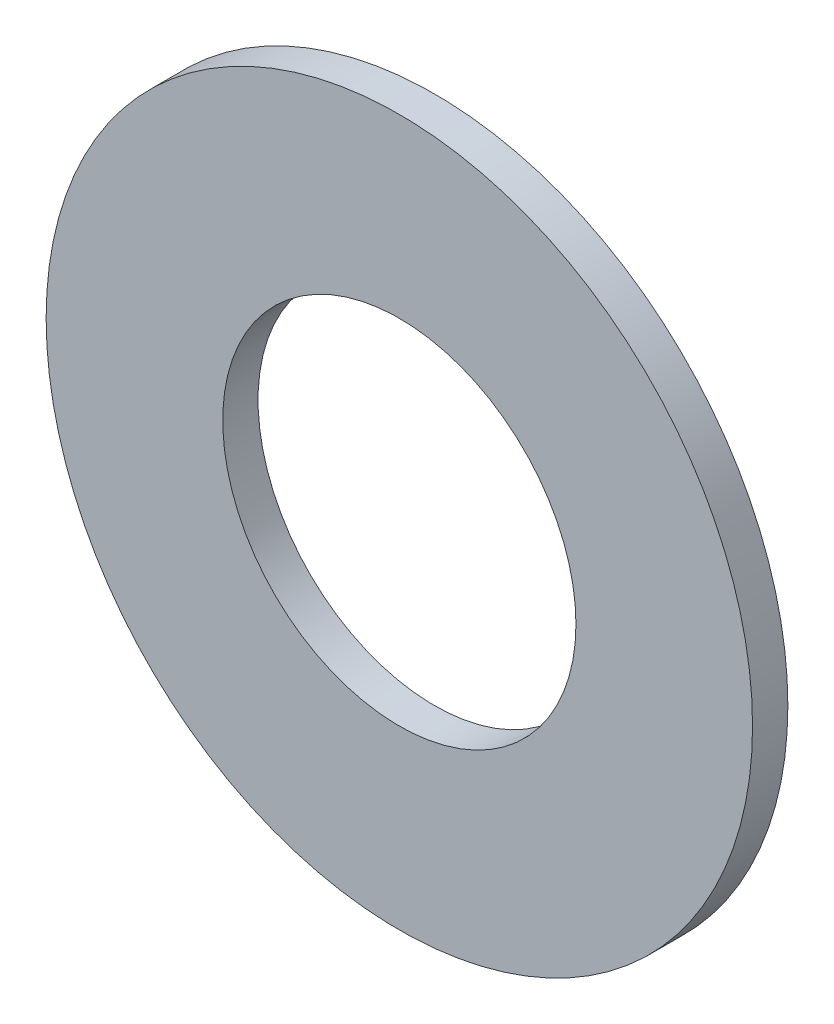
ISO-10303-21;
HEADER;
FILE_DESCRIPTION(('STEP AP214'),'2;1');
FILE_NAME('part.step','',(''),(''),'','','');
FILE_SCHEMA(('AUTOMOTIVE_DESIGN { 1 0 10303 214 1 1 1 1 }'));
ENDSEC;
DATA;
#1=APPLICATION_CONTEXT('core data for automotive mechanical design processes');
#2=APPLICATION_PROTOCOL_DEFINITION('international standard','automotive_design',2000,#1);
#3=PRODUCT_CONTEXT('',#1,'mechanical');
#4=PRODUCT('Part','Part','',(#3));
#5=PRODUCT_RELATED_PRODUCT_CATEGORY('part','',(#4));
#6=PRODUCT_DEFINITION_FORMATION('','',#4);
#7=PRODUCT_DEFINITION_CONTEXT('part definition',#1,'design');
#8=PRODUCT_DEFINITION('design','',#6,#7);
#9=PRODUCT_DEFINITION_SHAPE('','',#8);
#10=(LENGTH_UNIT() NAMED_UNIT(*) SI_UNIT(.MILLI.,.METRE.));
#11=(NAMED_UNIT(*) PLANE_ANGLE_UNIT() SI_UNIT($,.RADIAN.));
#12=(NAMED_UNIT(*) SI_UNIT($,.STERADIAN.) SOLID_ANGLE_UNIT());
#13=UNCERTAINTY_MEASURE_WITH_UNIT(LENGTH_MEASURE(1.E-05),#10,'distance_accuracy_value','');
#14=(GEOMETRIC_REPRESENTATION_CONTEXT(3) GLOBAL_UNCERTAINTY_ASSIGNED_CONTEXT((#13)) GLOBAL_UNIT_ASSIGNED_CONTEXT((#10,
#11,#12)) REPRESENTATION_CONTEXT('',''));
#15=CARTESIAN_POINT('',(0.,0.,0.));
#16=DIRECTION('',(0.,0.,1.));
#17=DIRECTION('',(1.,0.,0.));
#18=AXIS2_PLACEMENT_3D('',#15,#16,#17);
#19=CARTESIAN_POINT('',(0.,0.,0.1));
#20=DIRECTION('',(0.,0.,1.));
#21=DIRECTION('',(1.,0.,0.));
#22=AXIS2_PLACEMENT_3D('',#19,#20,#21);
#23=PLANE('',#22);
#24=CARTESIAN_POINT('',(0.,0.,0.1));
#25=DIRECTION('',(0.,0.,1.));
#26=DIRECTION('',(1.,0.,0.));
#27=AXIS2_PLACEMENT_3D('',#24,#25,#26);
#28=CIRCLE('',#27,2.);
#29=CARTESIAN_POINT('',(2.,0.,0.1));
#30=VERTEX_POINT('',#29);
#31=EDGE_CURVE('E10',#30,#30,#28,.T.);
#32=ORIENTED_EDGE('',*,*,#31,.T.);
#33=EDGE_LOOP('',(#32));
#34=FACE_BOUND('',#33,.T.);
#35=CARTESIAN_POINT('',(0.,0.,0.1));
#36=DIRECTION('',(0.,0.,1.));
#37=DIRECTION('',(1.,0.,0.));
#38=AXIS2_PLACEMENT_3D('',#35,#36,#37);
#39=CIRCLE('',#38,1.);
#40=CARTESIAN_POINT('',(1.,0.,0.1));
#41=VERTEX_POINT('',#40);
#42=EDGE_CURVE('E42',#41,#41,#39,.T.);
#43=ORIENTED_EDGE('',*,*,#42,.F.);
#44=EDGE_LOOP('',(#43));
#45=FACE_BOUND('',#44,.T.);
#46=ADVANCED_FACE('F31',(#34,#45),#23,.T.);
#47=CARTESIAN_POINT('',(0.,0.,-0.1));
#48=DIRECTION('',(0.,0.,1.));
#49=DIRECTION('',(1.,0.,0.));
#50=AXIS2_PLACEMENT_3D('',#47,#48,#49);
#51=PLANE('',#50);
#52=CARTESIAN_POINT('',(0.,0.,-0.1));
#53=DIRECTION('',(0.,0.,1.));
#54=DIRECTION('',(1.,0.,0.));
#55=AXIS2_PLACEMENT_3D('',#52,#53,#54);
#56=CIRCLE('',#55,2.);
#57=CARTESIAN_POINT('',(2.,0.,-0.1));
#58=VERTEX_POINT('',#57);
#59=EDGE_CURVE('E35',#58,#58,#56,.T.);
#60=ORIENTED_EDGE('',*,*,#59,.F.);
#61=EDGE_LOOP('',(#60));
#62=FACE_BOUND('',#61,.T.);
#63=CARTESIAN_POINT('',(0.,0.,-0.1));
#64=DIRECTION('',(0.,0.,1.));
#65=DIRECTION('',(1.,0.,0.));
#66=AXIS2_PLACEMENT_3D('',#63,#64,#65);
#67=CIRCLE('',#66,1.);
#68=CARTESIAN_POINT('',(1.,0.,-0.1));
#69=VERTEX_POINT('',#68);
#70=EDGE_CURVE('E44',#69,#69,#67,.T.);
#71=ORIENTED_EDGE('',*,*,#70,.T.);
#72=EDGE_LOOP('',(#71));
#73=FACE_BOUND('',#72,.T.);
#74=ADVANCED_FACE('F54',(#62,#73),#51,.F.);
#75=CARTESIAN_POINT('',(0.,0.,0.1));
#76=DIRECTION('',(0.,0.,-1.));
#77=DIRECTION('',(-1.,0.,0.));
#78=AXIS2_PLACEMENT_3D('',#75,#76,#77);
#79=CYLINDRICAL_SURFACE('',#78,2.);
#80=ORIENTED_EDGE('',*,*,#31,.F.);
#81=EDGE_LOOP('',(#80));
#82=FACE_BOUND('',#81,.T.);
#83=ORIENTED_EDGE('',*,*,#59,.T.);
#84=EDGE_LOOP('',(#83));
#85=FACE_BOUND('',#84,.T.);
#86=ADVANCED_FACE('F33',(#82,#85),#79,.T.);
#87=CARTESIAN_POINT('',(0.,0.,0.1));
#88=DIRECTION('',(0.,0.,-1.));
#89=DIRECTION('',(-1.,0.,0.));
#90=AXIS2_PLACEMENT_3D('',#87,#88,#89);
#91=CYLINDRICAL_SURFACE('',#90,1.);
#92=ORIENTED_EDGE('',*,*,#42,.T.);
#93=EDGE_LOOP('',(#92));
#94=FACE_BOUND('',#93,.T.);
#95=ORIENTED_EDGE('',*,*,#70,.F.);
#96=EDGE_LOOP('',(#95));
#97=FACE_BOUND('',#96,.T.);
#98=ADVANCED_FACE('F50',(#94,#97),#91,.F.);
#99=CLOSED_SHELL('',(#46,#74,#86,#98));
#100=MANIFOLD_SOLID_BREP('B2',#99);
#101=ADVANCED_BREP_SHAPE_REPRESENTATION('',(#18,#100),#14);
#102=SHAPE_DEFINITION_REPRESENTATION(#9,#101);
ENDSEC;
END-ISO-10303-21;
